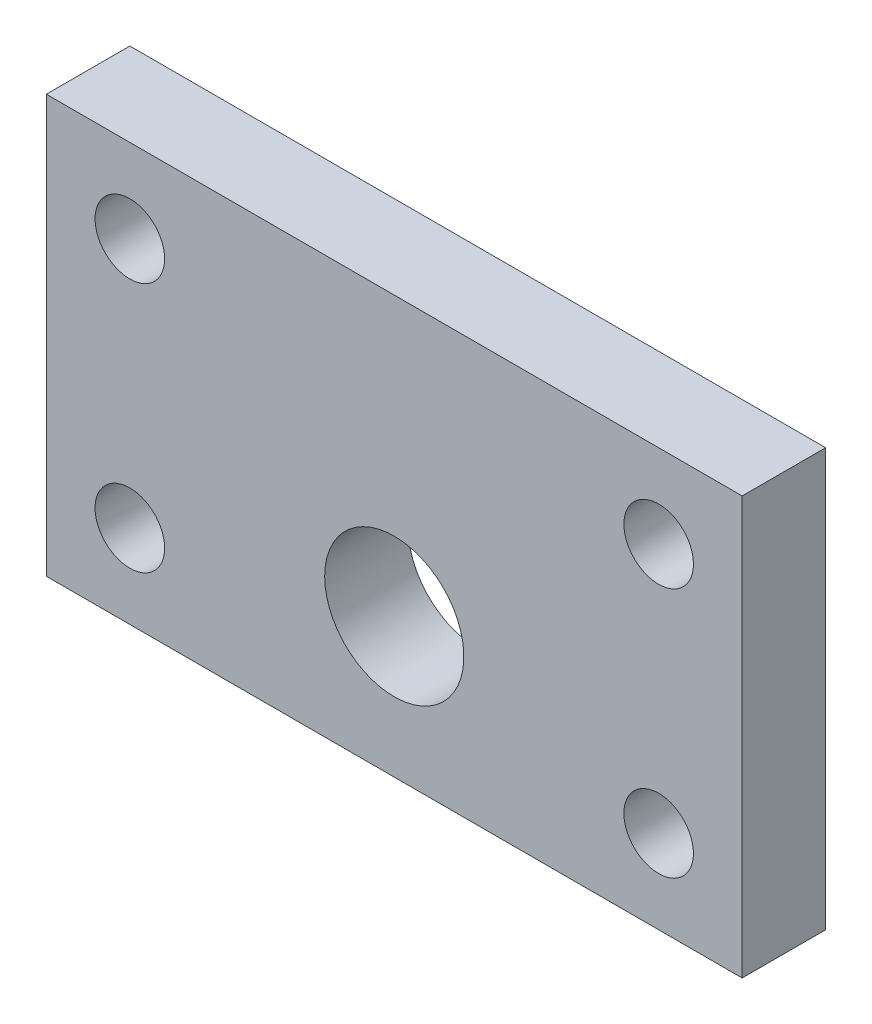
ISO-10303-21;
HEADER;
FILE_DESCRIPTION(('STEP AP214'),'2;1');
FILE_NAME('part.step','',(''),(''),'','','');
FILE_SCHEMA(('AUTOMOTIVE_DESIGN { 1 0 10303 214 1 1 1 1 }'));
ENDSEC;
DATA;
#1=APPLICATION_CONTEXT('core data for automotive mechanical design processes');
#2=APPLICATION_PROTOCOL_DEFINITION('international standard','automotive_design',2000,#1);
#3=PRODUCT_CONTEXT('',#1,'mechanical');
#4=PRODUCT('Part','Part','',(#3));
#5=PRODUCT_RELATED_PRODUCT_CATEGORY('part','',(#4));
#6=PRODUCT_DEFINITION_FORMATION('','',#4);
#7=PRODUCT_DEFINITION_CONTEXT('part definition',#1,'design');
#8=PRODUCT_DEFINITION('design','',#6,#7);
#9=PRODUCT_DEFINITION_SHAPE('','',#8);
#10=(LENGTH_UNIT() NAMED_UNIT(*) SI_UNIT(.MILLI.,.METRE.));
#11=(NAMED_UNIT(*) PLANE_ANGLE_UNIT() SI_UNIT($,.RADIAN.));
#12=(NAMED_UNIT(*) SI_UNIT($,.STERADIAN.) SOLID_ANGLE_UNIT());
#13=UNCERTAINTY_MEASURE_WITH_UNIT(LENGTH_MEASURE(1.E-05),#10,'distance_accuracy_value','');
#14=(GEOMETRIC_REPRESENTATION_CONTEXT(3) GLOBAL_UNCERTAINTY_ASSIGNED_CONTEXT((#13)) GLOBAL_UNIT_ASSIGNED_CONTEXT((#10,
#11,#12)) REPRESENTATION_CONTEXT('',''));
#15=CARTESIAN_POINT('',(0.,0.,0.));
#16=DIRECTION('',(0.,0.,1.));
#17=DIRECTION('',(1.,0.,0.));
#18=AXIS2_PLACEMENT_3D('',#15,#16,#17);
#19=CARTESIAN_POINT('',(0.,0.,30.));
#20=DIRECTION('',(0.,0.,-1.));
#21=DIRECTION('',(-1.,0.,0.));
#22=AXIS2_PLACEMENT_3D('',#19,#20,#21);
#23=PLANE('',#22);
#24=CARTESIAN_POINT('',(0.,-25.,30.));
#25=DIRECTION('',(0.,0.,-1.));
#26=DIRECTION('',(-1.,0.,0.));
#27=AXIS2_PLACEMENT_3D('',#24,#25,#26);
#28=CIRCLE('',#27,25.);
#29=CARTESIAN_POINT('',(-25.,-25.,30.));
#30=VERTEX_POINT('',#29);
#31=EDGE_CURVE('E137',#30,#30,#28,.T.);
#32=ORIENTED_EDGE('',*,*,#31,.T.);
#33=EDGE_LOOP('',(#32));
#34=FACE_BOUND('',#33,.T.);
#35=DIRECTION('',(0.,1.,0.));
#36=VECTOR('',#35,1.);
#37=CARTESIAN_POINT('',(125.,-75.,30.));
#38=LINE('',#37,#36);
#39=CARTESIAN_POINT('',(125.,-75.,30.));
#40=VERTEX_POINT('',#39);
#41=CARTESIAN_POINT('',(125.,75.,30.));
#42=VERTEX_POINT('',#41);
#43=EDGE_CURVE('E89',#40,#42,#38,.T.);
#44=ORIENTED_EDGE('',*,*,#43,.T.);
#45=DIRECTION('',(-1.,0.,0.));
#46=VECTOR('',#45,1.);
#47=CARTESIAN_POINT('',(-125.,75.,30.));
#48=LINE('',#47,#46);
#49=CARTESIAN_POINT('',(-125.,75.,30.));
#50=VERTEX_POINT('',#49);
#51=EDGE_CURVE('E84',#42,#50,#48,.T.);
#52=ORIENTED_EDGE('',*,*,#51,.T.);
#53=DIRECTION('',(0.,-1.,0.));
#54=VECTOR('',#53,1.);
#55=CARTESIAN_POINT('',(-125.,-75.,30.));
#56=LINE('',#55,#54);
#57=CARTESIAN_POINT('',(-125.,-75.,30.));
#58=VERTEX_POINT('',#57);
#59=EDGE_CURVE('E87',#50,#58,#56,.T.);
#60=ORIENTED_EDGE('',*,*,#59,.T.);
#61=DIRECTION('',(1.,0.,0.));
#62=VECTOR('',#61,1.);
#63=CARTESIAN_POINT('',(-125.,-75.,30.));
#64=LINE('',#63,#62);
#65=EDGE_CURVE('E54',#58,#40,#64,.T.);
#66=ORIENTED_EDGE('',*,*,#65,.T.);
#67=EDGE_LOOP('',(#44,#52,#60,#66));
#68=FACE_BOUND('',#67,.T.);
#69=CARTESIAN_POINT('',(-95.,-45.,30.));
#70=DIRECTION('',(0.,0.,1.));
#71=DIRECTION('',(1.,0.,0.));
#72=AXIS2_PLACEMENT_3D('',#69,#70,#71);
#73=CIRCLE('',#72,12.5);
#74=CARTESIAN_POINT('',(-82.5,-45.,30.));
#75=VERTEX_POINT('',#74);
#76=EDGE_CURVE('E104',#75,#75,#73,.T.);
#77=ORIENTED_EDGE('',*,*,#76,.F.);
#78=EDGE_LOOP('',(#77));
#79=FACE_BOUND('',#78,.T.);
#80=CARTESIAN_POINT('',(95.,-45.,30.));
#81=DIRECTION('',(0.,0.,1.));
#82=DIRECTION('',(1.,0.,0.));
#83=AXIS2_PLACEMENT_3D('',#80,#81,#82);
#84=CIRCLE('',#83,12.5);
#85=CARTESIAN_POINT('',(107.5,-45.,30.));
#86=VERTEX_POINT('',#85);
#87=EDGE_CURVE('E119',#86,#86,#84,.T.);
#88=ORIENTED_EDGE('',*,*,#87,.F.);
#89=EDGE_LOOP('',(#88));
#90=FACE_BOUND('',#89,.T.);
#91=CARTESIAN_POINT('',(94.9999999999997,45.,30.));
#92=DIRECTION('',(0.,0.,1.));
#93=DIRECTION('',(1.,0.,0.));
#94=AXIS2_PLACEMENT_3D('',#91,#92,#93);
#95=CIRCLE('',#94,12.5);
#96=CARTESIAN_POINT('',(107.5,45.,30.));
#97=VERTEX_POINT('',#96);
#98=EDGE_CURVE('E125',#97,#97,#95,.T.);
#99=ORIENTED_EDGE('',*,*,#98,.F.);
#100=EDGE_LOOP('',(#99));
#101=FACE_BOUND('',#100,.T.);
#102=CARTESIAN_POINT('',(-95.0000000000003,45.,30.));
#103=DIRECTION('',(0.,0.,1.));
#104=DIRECTION('',(1.,0.,0.));
#105=AXIS2_PLACEMENT_3D('',#102,#103,#104);
#106=CIRCLE('',#105,12.5);
#107=CARTESIAN_POINT('',(-82.5000000000003,45.,30.));
#108=VERTEX_POINT('',#107);
#109=EDGE_CURVE('E131',#108,#108,#106,.T.);
#110=ORIENTED_EDGE('',*,*,#109,.F.);
#111=EDGE_LOOP('',(#110));
#112=FACE_BOUND('',#111,.T.);
#113=ADVANCED_FACE('F37',(#34,#68,#79,#90,#101,#112),#23,.F.);
#114=CARTESIAN_POINT('',(0.,0.,0.));
#115=DIRECTION('',(0.,0.,-1.));
#116=DIRECTION('',(-1.,0.,0.));
#117=AXIS2_PLACEMENT_3D('',#114,#115,#116);
#118=PLANE('',#117);
#119=CARTESIAN_POINT('',(0.,-25.,0.));
#120=DIRECTION('',(0.,0.,-1.));
#121=DIRECTION('',(-1.,0.,0.));
#122=AXIS2_PLACEMENT_3D('',#119,#120,#121);
#123=CIRCLE('',#122,25.);
#124=CARTESIAN_POINT('',(-25.,-25.,0.));
#125=VERTEX_POINT('',#124);
#126=EDGE_CURVE('E140',#125,#125,#123,.T.);
#127=ORIENTED_EDGE('',*,*,#126,.F.);
#128=EDGE_LOOP('',(#127));
#129=FACE_BOUND('',#128,.T.);
#130=CARTESIAN_POINT('',(94.9999999999997,45.,0.));
#131=DIRECTION('',(0.,0.,1.));
#132=DIRECTION('',(1.,0.,0.));
#133=AXIS2_PLACEMENT_3D('',#130,#131,#132);
#134=CIRCLE('',#133,12.5);
#135=CARTESIAN_POINT('',(107.5,45.,0.));
#136=VERTEX_POINT('',#135);
#137=EDGE_CURVE('E128',#136,#136,#134,.T.);
#138=ORIENTED_EDGE('',*,*,#137,.T.);
#139=EDGE_LOOP('',(#138));
#140=FACE_BOUND('',#139,.T.);
#141=CARTESIAN_POINT('',(-95.,-45.,0.));
#142=DIRECTION('',(0.,0.,1.));
#143=DIRECTION('',(1.,0.,0.));
#144=AXIS2_PLACEMENT_3D('',#141,#142,#143);
#145=CIRCLE('',#144,12.5);
#146=CARTESIAN_POINT('',(-82.5,-45.,0.));
#147=VERTEX_POINT('',#146);
#148=EDGE_CURVE('E116',#147,#147,#145,.T.);
#149=ORIENTED_EDGE('',*,*,#148,.T.);
#150=EDGE_LOOP('',(#149));
#151=FACE_BOUND('',#150,.T.);
#152=DIRECTION('',(0.,1.,0.));
#153=VECTOR('',#152,1.);
#154=CARTESIAN_POINT('',(125.,-75.,0.));
#155=LINE('',#154,#153);
#156=CARTESIAN_POINT('',(125.,-75.,0.));
#157=VERTEX_POINT('',#156);
#158=CARTESIAN_POINT('',(125.,75.,0.));
#159=VERTEX_POINT('',#158);
#160=EDGE_CURVE('E101',#157,#159,#155,.T.);
#161=ORIENTED_EDGE('',*,*,#160,.F.);
#162=DIRECTION('',(1.,0.,0.));
#163=VECTOR('',#162,1.);
#164=CARTESIAN_POINT('',(-125.,-75.,0.));
#165=LINE('',#164,#163);
#166=CARTESIAN_POINT('',(-125.,-75.,0.));
#167=VERTEX_POINT('',#166);
#168=EDGE_CURVE('E77',#167,#157,#165,.T.);
#169=ORIENTED_EDGE('',*,*,#168,.F.);
#170=DIRECTION('',(0.,-1.,0.));
#171=VECTOR('',#170,1.);
#172=CARTESIAN_POINT('',(-125.,-75.,0.));
#173=LINE('',#172,#171);
#174=CARTESIAN_POINT('',(-125.,75.,0.));
#175=VERTEX_POINT('',#174);
#176=EDGE_CURVE('E71',#175,#167,#173,.T.);
#177=ORIENTED_EDGE('',*,*,#176,.F.);
#178=DIRECTION('',(-1.,0.,0.));
#179=VECTOR('',#178,1.);
#180=CARTESIAN_POINT('',(-125.,75.,0.));
#181=LINE('',#180,#179);
#182=EDGE_CURVE('E93',#159,#175,#181,.T.);
#183=ORIENTED_EDGE('',*,*,#182,.F.);
#184=EDGE_LOOP('',(#161,#169,#177,#183));
#185=FACE_BOUND('',#184,.T.);
#186=CARTESIAN_POINT('',(95.,-45.,0.));
#187=DIRECTION('',(0.,0.,1.));
#188=DIRECTION('',(1.,0.,0.));
#189=AXIS2_PLACEMENT_3D('',#186,#187,#188);
#190=CIRCLE('',#189,12.5);
#191=CARTESIAN_POINT('',(107.5,-45.,0.));
#192=VERTEX_POINT('',#191);
#193=EDGE_CURVE('E122',#192,#192,#190,.T.);
#194=ORIENTED_EDGE('',*,*,#193,.T.);
#195=EDGE_LOOP('',(#194));
#196=FACE_BOUND('',#195,.T.);
#197=CARTESIAN_POINT('',(-95.0000000000003,45.,0.));
#198=DIRECTION('',(0.,0.,1.));
#199=DIRECTION('',(1.,0.,0.));
#200=AXIS2_PLACEMENT_3D('',#197,#198,#199);
#201=CIRCLE('',#200,12.5);
#202=CARTESIAN_POINT('',(-82.5000000000003,45.,0.));
#203=VERTEX_POINT('',#202);
#204=EDGE_CURVE('E134',#203,#203,#201,.T.);
#205=ORIENTED_EDGE('',*,*,#204,.T.);
#206=EDGE_LOOP('',(#205));
#207=FACE_BOUND('',#206,.T.);
#208=ADVANCED_FACE('F112',(#129,#140,#151,#185,#196,#207),#118,.T.);
#209=CARTESIAN_POINT('',(125.,-75.,30.));
#210=DIRECTION('',(-1.,0.,0.));
#211=DIRECTION('',(0.,0.,1.));
#212=AXIS2_PLACEMENT_3D('',#209,#210,#211);
#213=PLANE('',#212);
#214=ORIENTED_EDGE('',*,*,#160,.T.);
#215=DIRECTION('',(0.,0.,-1.));
#216=VECTOR('',#215,1.);
#217=CARTESIAN_POINT('',(125.,75.,30.));
#218=LINE('',#217,#216);
#219=EDGE_CURVE('E11',#42,#159,#218,.T.);
#220=ORIENTED_EDGE('',*,*,#219,.F.);
#221=ORIENTED_EDGE('',*,*,#43,.F.);
#222=DIRECTION('',(0.,0.,-1.));
#223=VECTOR('',#222,1.);
#224=CARTESIAN_POINT('',(125.,-75.,30.));
#225=LINE('',#224,#223);
#226=EDGE_CURVE('E97',#40,#157,#225,.T.);
#227=ORIENTED_EDGE('',*,*,#226,.T.);
#228=EDGE_LOOP('',(#214,#220,#221,#227));
#229=FACE_BOUND('',#228,.T.);
#230=ADVANCED_FACE('F39',(#229),#213,.F.);
#231=CARTESIAN_POINT('',(-125.,75.,30.));
#232=DIRECTION('',(0.,-1.,0.));
#233=DIRECTION('',(0.,0.,-1.));
#234=AXIS2_PLACEMENT_3D('',#231,#232,#233);
#235=PLANE('',#234);
#236=ORIENTED_EDGE('',*,*,#182,.T.);
#237=DIRECTION('',(0.,0.,-1.));
#238=VECTOR('',#237,1.);
#239=CARTESIAN_POINT('',(-125.,75.,30.));
#240=LINE('',#239,#238);
#241=EDGE_CURVE('E46',#50,#175,#240,.T.);
#242=ORIENTED_EDGE('',*,*,#241,.F.);
#243=ORIENTED_EDGE('',*,*,#51,.F.);
#244=ORIENTED_EDGE('',*,*,#219,.T.);
#245=EDGE_LOOP('',(#236,#242,#243,#244));
#246=FACE_BOUND('',#245,.T.);
#247=ADVANCED_FACE('F92',(#246),#235,.F.);
#248=CARTESIAN_POINT('',(-125.,-75.,30.));
#249=DIRECTION('',(1.,0.,0.));
#250=DIRECTION('',(0.,0.,-1.));
#251=AXIS2_PLACEMENT_3D('',#248,#249,#250);
#252=PLANE('',#251);
#253=ORIENTED_EDGE('',*,*,#176,.T.);
#254=DIRECTION('',(0.,0.,-1.));
#255=VECTOR('',#254,1.);
#256=CARTESIAN_POINT('',(-125.,-75.,30.));
#257=LINE('',#256,#255);
#258=EDGE_CURVE('E94',#58,#167,#257,.T.);
#259=ORIENTED_EDGE('',*,*,#258,.F.);
#260=ORIENTED_EDGE('',*,*,#59,.F.);
#261=ORIENTED_EDGE('',*,*,#241,.T.);
#262=EDGE_LOOP('',(#253,#259,#260,#261));
#263=FACE_BOUND('',#262,.T.);
#264=ADVANCED_FACE('F95',(#263),#252,.F.);
#265=CARTESIAN_POINT('',(-125.,-75.,30.));
#266=DIRECTION('',(0.,1.,0.));
#267=DIRECTION('',(0.,0.,1.));
#268=AXIS2_PLACEMENT_3D('',#265,#266,#267);
#269=PLANE('',#268);
#270=ORIENTED_EDGE('',*,*,#168,.T.);
#271=ORIENTED_EDGE('',*,*,#226,.F.);
#272=ORIENTED_EDGE('',*,*,#65,.F.);
#273=ORIENTED_EDGE('',*,*,#258,.T.);
#274=EDGE_LOOP('',(#270,#271,#272,#273));
#275=FACE_BOUND('',#274,.T.);
#276=ADVANCED_FACE('F109',(#275),#269,.F.);
#277=CARTESIAN_POINT('',(-95.,-45.,30.));
#278=DIRECTION('',(0.,0.,-1.));
#279=DIRECTION('',(-1.,0.,0.));
#280=AXIS2_PLACEMENT_3D('',#277,#278,#279);
#281=CYLINDRICAL_SURFACE('',#280,12.5);
#282=ORIENTED_EDGE('',*,*,#76,.T.);
#283=EDGE_LOOP('',(#282));
#284=FACE_BOUND('',#283,.T.);
#285=ORIENTED_EDGE('',*,*,#148,.F.);
#286=EDGE_LOOP('',(#285));
#287=FACE_BOUND('',#286,.T.);
#288=ADVANCED_FACE('F161',(#284,#287),#281,.F.);
#289=CARTESIAN_POINT('',(95.,-45.,30.));
#290=DIRECTION('',(0.,0.,-1.));
#291=DIRECTION('',(-1.,0.,0.));
#292=AXIS2_PLACEMENT_3D('',#289,#290,#291);
#293=CYLINDRICAL_SURFACE('',#292,12.5);
#294=ORIENTED_EDGE('',*,*,#87,.T.);
#295=EDGE_LOOP('',(#294));
#296=FACE_BOUND('',#295,.T.);
#297=ORIENTED_EDGE('',*,*,#193,.F.);
#298=EDGE_LOOP('',(#297));
#299=FACE_BOUND('',#298,.T.);
#300=ADVANCED_FACE('F163',(#296,#299),#293,.F.);
#301=CARTESIAN_POINT('',(94.9999999999997,45.,30.));
#302=DIRECTION('',(0.,0.,-1.));
#303=DIRECTION('',(-1.,0.,0.));
#304=AXIS2_PLACEMENT_3D('',#301,#302,#303);
#305=CYLINDRICAL_SURFACE('',#304,12.5);
#306=ORIENTED_EDGE('',*,*,#98,.T.);
#307=EDGE_LOOP('',(#306));
#308=FACE_BOUND('',#307,.T.);
#309=ORIENTED_EDGE('',*,*,#137,.F.);
#310=EDGE_LOOP('',(#309));
#311=FACE_BOUND('',#310,.T.);
#312=ADVANCED_FACE('F170',(#308,#311),#305,.F.);
#313=CARTESIAN_POINT('',(-95.0000000000003,45.,30.));
#314=DIRECTION('',(0.,0.,-1.));
#315=DIRECTION('',(-1.,0.,0.));
#316=AXIS2_PLACEMENT_3D('',#313,#314,#315);
#317=CYLINDRICAL_SURFACE('',#316,12.5);
#318=ORIENTED_EDGE('',*,*,#109,.T.);
#319=EDGE_LOOP('',(#318));
#320=FACE_BOUND('',#319,.T.);
#321=ORIENTED_EDGE('',*,*,#204,.F.);
#322=EDGE_LOOP('',(#321));
#323=FACE_BOUND('',#322,.T.);
#324=ADVANCED_FACE('F150',(#320,#323),#317,.F.);
#325=CARTESIAN_POINT('',(0.,-25.,30.));
#326=DIRECTION('',(0.,0.,-1.));
#327=DIRECTION('',(-1.,0.,0.));
#328=AXIS2_PLACEMENT_3D('',#325,#326,#327);
#329=CYLINDRICAL_SURFACE('',#328,25.);
#330=ORIENTED_EDGE('',*,*,#31,.F.);
#331=EDGE_LOOP('',(#330));
#332=FACE_BOUND('',#331,.T.);
#333=ORIENTED_EDGE('',*,*,#126,.T.);
#334=EDGE_LOOP('',(#333));
#335=FACE_BOUND('',#334,.T.);
#336=ADVANCED_FACE('F147',(#332,#335),#329,.F.);
#337=CLOSED_SHELL('',(#113,#208,#230,#247,#264,#276,#288,#300,#312,#324,#336));
#338=MANIFOLD_SOLID_BREP('B2',#337);
#339=ADVANCED_BREP_SHAPE_REPRESENTATION('',(#18,#338),#14);
#340=SHAPE_DEFINITION_REPRESENTATION(#9,#339);
ENDSEC;
END-ISO-10303-21;
